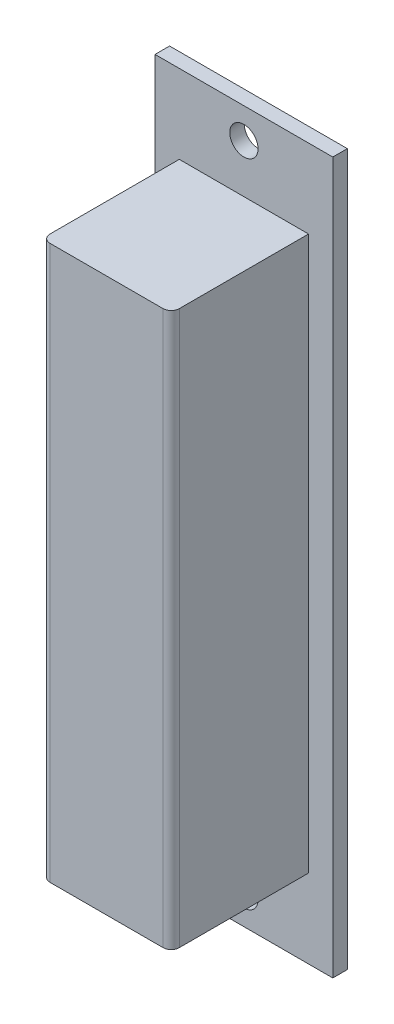
ISO-10303-21;
HEADER;
FILE_DESCRIPTION(('STEP AP214'),'2;1');
FILE_NAME('part.step','',(''),(''),'','','');
FILE_SCHEMA(('AUTOMOTIVE_DESIGN { 1 0 10303 214 1 1 1 1 }'));
ENDSEC;
DATA;
#1=APPLICATION_CONTEXT('core data for automotive mechanical design processes');
#2=APPLICATION_PROTOCOL_DEFINITION('international standard','automotive_design',2000,#1);
#3=PRODUCT_CONTEXT('',#1,'mechanical');
#4=PRODUCT('Part','Part','',(#3));
#5=PRODUCT_RELATED_PRODUCT_CATEGORY('part','',(#4));
#6=PRODUCT_DEFINITION_FORMATION('','',#4);
#7=PRODUCT_DEFINITION_CONTEXT('part definition',#1,'design');
#8=PRODUCT_DEFINITION('design','',#6,#7);
#9=PRODUCT_DEFINITION_SHAPE('','',#8);
#10=(LENGTH_UNIT() NAMED_UNIT(*) SI_UNIT(.MILLI.,.METRE.));
#11=(NAMED_UNIT(*) PLANE_ANGLE_UNIT() SI_UNIT($,.RADIAN.));
#12=(NAMED_UNIT(*) SI_UNIT($,.STERADIAN.) SOLID_ANGLE_UNIT());
#13=UNCERTAINTY_MEASURE_WITH_UNIT(LENGTH_MEASURE(1.E-05),#10,'distance_accuracy_value','');
#14=(GEOMETRIC_REPRESENTATION_CONTEXT(3) GLOBAL_UNCERTAINTY_ASSIGNED_CONTEXT((#13)) GLOBAL_UNIT_ASSIGNED_CONTEXT((#10,
#11,#12)) REPRESENTATION_CONTEXT('',''));
#15=CARTESIAN_POINT('',(0.,0.,0.));
#16=DIRECTION('',(0.,0.,1.));
#17=DIRECTION('',(1.,0.,0.));
#18=AXIS2_PLACEMENT_3D('',#15,#16,#17);
#19=CARTESIAN_POINT('',(-11.,-44.,1.8));
#20=DIRECTION('',(0.,0.,1.));
#21=DIRECTION('',(1.,0.,0.));
#22=AXIS2_PLACEMENT_3D('',#19,#20,#21);
#23=PLANE('',#22);
#24=CARTESIAN_POINT('',(0.,-40.25,1.8));
#25=DIRECTION('',(0.,0.,1.));
#26=DIRECTION('',(-1.,0.,0.));
#27=AXIS2_PLACEMENT_3D('',#24,#25,#26);
#28=CIRCLE('',#27,1.75);
#29=CARTESIAN_POINT('',(-1.75000000000005,-40.25,1.8));
#30=VERTEX_POINT('',#29);
#31=EDGE_CURVE('E144',#30,#30,#28,.T.);
#32=ORIENTED_EDGE('',*,*,#31,.F.);
#33=EDGE_LOOP('',(#32));
#34=FACE_BOUND('',#33,.T.);
#35=DIRECTION('',(0.,-1.,0.));
#36=VECTOR('',#35,1.);
#37=CARTESIAN_POINT('',(-11.,44.,1.8));
#38=LINE('',#37,#36);
#39=CARTESIAN_POINT('',(-11.,44.,1.8));
#40=VERTEX_POINT('',#39);
#41=CARTESIAN_POINT('',(-11.,-44.,1.8));
#42=VERTEX_POINT('',#41);
#43=EDGE_CURVE('E162',#40,#42,#38,.T.);
#44=ORIENTED_EDGE('',*,*,#43,.T.);
#45=DIRECTION('',(1.,0.,0.));
#46=VECTOR('',#45,1.);
#47=CARTESIAN_POINT('',(-11.,-44.,1.8));
#48=LINE('',#47,#46);
#49=CARTESIAN_POINT('',(11.,-44.,1.8));
#50=VERTEX_POINT('',#49);
#51=EDGE_CURVE('E165',#42,#50,#48,.T.);
#52=ORIENTED_EDGE('',*,*,#51,.T.);
#53=DIRECTION('',(0.,1.,0.));
#54=VECTOR('',#53,1.);
#55=CARTESIAN_POINT('',(11.,-44.,1.8));
#56=LINE('',#55,#54);
#57=CARTESIAN_POINT('',(11.,44.,1.8));
#58=VERTEX_POINT('',#57);
#59=EDGE_CURVE('E167',#50,#58,#56,.T.);
#60=ORIENTED_EDGE('',*,*,#59,.T.);
#61=DIRECTION('',(-1.,0.,0.));
#62=VECTOR('',#61,1.);
#63=CARTESIAN_POINT('',(-11.,44.,1.8));
#64=LINE('',#63,#62);
#65=EDGE_CURVE('E169',#58,#40,#64,.T.);
#66=ORIENTED_EDGE('',*,*,#65,.T.);
#67=EDGE_LOOP('',(#44,#52,#60,#66));
#68=FACE_BOUND('',#67,.T.);
#69=CARTESIAN_POINT('',(0.,40.25,1.8));
#70=DIRECTION('',(0.,0.,1.));
#71=DIRECTION('',(1.,0.,0.));
#72=AXIS2_PLACEMENT_3D('',#69,#70,#71);
#73=CIRCLE('',#72,1.75);
#74=CARTESIAN_POINT('',(1.75,40.25,1.8));
#75=VERTEX_POINT('',#74);
#76=EDGE_CURVE('E150',#75,#75,#73,.T.);
#77=ORIENTED_EDGE('',*,*,#76,.F.);
#78=EDGE_LOOP('',(#77));
#79=FACE_BOUND('',#78,.T.);
#80=DIRECTION('',(1.,0.,0.));
#81=VECTOR('',#80,1.);
#82=CARTESIAN_POINT('',(-8.,-34.25,1.8));
#83=LINE('',#82,#81);
#84=CARTESIAN_POINT('',(-8.,-34.25,1.8));
#85=VERTEX_POINT('',#84);
#86=CARTESIAN_POINT('',(8.00000000000001,-34.25,1.8));
#87=VERTEX_POINT('',#86);
#88=EDGE_CURVE('E111',#85,#87,#83,.T.);
#89=ORIENTED_EDGE('',*,*,#88,.F.);
#90=DIRECTION('',(0.,-1.,0.));
#91=VECTOR('',#90,1.);
#92=CARTESIAN_POINT('',(-8.,34.25,1.8));
#93=LINE('',#92,#91);
#94=CARTESIAN_POINT('',(-8.,34.25,1.8));
#95=VERTEX_POINT('',#94);
#96=EDGE_CURVE('E118',#95,#85,#93,.T.);
#97=ORIENTED_EDGE('',*,*,#96,.F.);
#98=DIRECTION('',(-1.,0.,0.));
#99=VECTOR('',#98,1.);
#100=CARTESIAN_POINT('',(-8.,34.25,1.8));
#101=LINE('',#100,#99);
#102=CARTESIAN_POINT('',(8.,34.25,1.8));
#103=VERTEX_POINT('',#102);
#104=EDGE_CURVE('E128',#103,#95,#101,.T.);
#105=ORIENTED_EDGE('',*,*,#104,.F.);
#106=DIRECTION('',(0.,1.,0.));
#107=VECTOR('',#106,1.);
#108=CARTESIAN_POINT('',(8.00000000000001,-34.25,1.8));
#109=LINE('',#108,#107);
#110=EDGE_CURVE('E126',#87,#103,#109,.T.);
#111=ORIENTED_EDGE('',*,*,#110,.F.);
#112=EDGE_LOOP('',(#89,#97,#105,#111));
#113=FACE_BOUND('',#112,.T.);
#114=ADVANCED_FACE('F29',(#34,#68,#79,#113),#23,.T.);
#115=CARTESIAN_POINT('',(-11.,-44.,0.));
#116=DIRECTION('',(0.,0.,1.));
#117=DIRECTION('',(1.,0.,0.));
#118=AXIS2_PLACEMENT_3D('',#115,#116,#117);
#119=PLANE('',#118);
#120=CARTESIAN_POINT('',(0.,40.25,0.));
#121=DIRECTION('',(0.,0.,1.));
#122=DIRECTION('',(1.,0.,0.));
#123=AXIS2_PLACEMENT_3D('',#120,#121,#122);
#124=CIRCLE('',#123,1.75);
#125=CARTESIAN_POINT('',(1.75,40.25,0.));
#126=VERTEX_POINT('',#125);
#127=EDGE_CURVE('E147',#126,#126,#124,.T.);
#128=ORIENTED_EDGE('',*,*,#127,.T.);
#129=EDGE_LOOP('',(#128));
#130=FACE_BOUND('',#129,.T.);
#131=DIRECTION('',(0.,-1.,0.));
#132=VECTOR('',#131,1.);
#133=CARTESIAN_POINT('',(-11.,44.,0.));
#134=LINE('',#133,#132);
#135=CARTESIAN_POINT('',(-11.,44.,0.));
#136=VERTEX_POINT('',#135);
#137=CARTESIAN_POINT('',(-11.,-44.,0.));
#138=VERTEX_POINT('',#137);
#139=EDGE_CURVE('E153',#136,#138,#134,.T.);
#140=ORIENTED_EDGE('',*,*,#139,.F.);
#141=DIRECTION('',(-1.,0.,0.));
#142=VECTOR('',#141,1.);
#143=CARTESIAN_POINT('',(-11.,44.,0.));
#144=LINE('',#143,#142);
#145=CARTESIAN_POINT('',(11.,44.,0.));
#146=VERTEX_POINT('',#145);
#147=EDGE_CURVE('E160',#146,#136,#144,.T.);
#148=ORIENTED_EDGE('',*,*,#147,.F.);
#149=DIRECTION('',(0.,1.,0.));
#150=VECTOR('',#149,1.);
#151=CARTESIAN_POINT('',(11.,-44.,0.));
#152=LINE('',#151,#150);
#153=CARTESIAN_POINT('',(11.,-44.,0.));
#154=VERTEX_POINT('',#153);
#155=EDGE_CURVE('E158',#154,#146,#152,.T.);
#156=ORIENTED_EDGE('',*,*,#155,.F.);
#157=DIRECTION('',(1.,0.,0.));
#158=VECTOR('',#157,1.);
#159=CARTESIAN_POINT('',(-11.,-44.,0.));
#160=LINE('',#159,#158);
#161=EDGE_CURVE('E156',#138,#154,#160,.T.);
#162=ORIENTED_EDGE('',*,*,#161,.F.);
#163=EDGE_LOOP('',(#140,#148,#156,#162));
#164=FACE_BOUND('',#163,.T.);
#165=CARTESIAN_POINT('',(0.,-40.25,0.));
#166=DIRECTION('',(0.,0.,1.));
#167=DIRECTION('',(-1.,0.,0.));
#168=AXIS2_PLACEMENT_3D('',#165,#166,#167);
#169=CIRCLE('',#168,1.75);
#170=CARTESIAN_POINT('',(-1.75000000000005,-40.25,0.));
#171=VERTEX_POINT('',#170);
#172=EDGE_CURVE('E114',#171,#171,#169,.T.);
#173=ORIENTED_EDGE('',*,*,#172,.T.);
#174=EDGE_LOOP('',(#173));
#175=FACE_BOUND('',#174,.T.);
#176=ADVANCED_FACE('F212',(#130,#164,#175),#119,.F.);
#177=CARTESIAN_POINT('',(-11.,44.,1.8));
#178=DIRECTION('',(1.,0.,0.));
#179=DIRECTION('',(0.,1.,0.));
#180=AXIS2_PLACEMENT_3D('',#177,#178,#179);
#181=PLANE('',#180);
#182=ORIENTED_EDGE('',*,*,#139,.T.);
#183=DIRECTION('',(0.,0.,-1.));
#184=VECTOR('',#183,1.);
#185=CARTESIAN_POINT('',(-11.,-44.,1.8));
#186=LINE('',#185,#184);
#187=EDGE_CURVE('E180',#42,#138,#186,.T.);
#188=ORIENTED_EDGE('',*,*,#187,.F.);
#189=ORIENTED_EDGE('',*,*,#43,.F.);
#190=DIRECTION('',(0.,0.,-1.));
#191=VECTOR('',#190,1.);
#192=CARTESIAN_POINT('',(-11.,44.,1.8));
#193=LINE('',#192,#191);
#194=EDGE_CURVE('E171',#40,#136,#193,.T.);
#195=ORIENTED_EDGE('',*,*,#194,.T.);
#196=EDGE_LOOP('',(#182,#188,#189,#195));
#197=FACE_BOUND('',#196,.T.);
#198=ADVANCED_FACE('F31',(#197),#181,.F.);
#199=CARTESIAN_POINT('',(-11.,-44.,1.8));
#200=DIRECTION('',(0.,1.,0.));
#201=DIRECTION('',(0.,0.,1.));
#202=AXIS2_PLACEMENT_3D('',#199,#200,#201);
#203=PLANE('',#202);
#204=ORIENTED_EDGE('',*,*,#161,.T.);
#205=DIRECTION('',(0.,0.,-1.));
#206=VECTOR('',#205,1.);
#207=CARTESIAN_POINT('',(11.,-44.,1.8));
#208=LINE('',#207,#206);
#209=EDGE_CURVE('E177',#50,#154,#208,.T.);
#210=ORIENTED_EDGE('',*,*,#209,.F.);
#211=ORIENTED_EDGE('',*,*,#51,.F.);
#212=ORIENTED_EDGE('',*,*,#187,.T.);
#213=EDGE_LOOP('',(#204,#210,#211,#212));
#214=FACE_BOUND('',#213,.T.);
#215=ADVANCED_FACE('F233',(#214),#203,.F.);
#216=CARTESIAN_POINT('',(11.,-44.,1.8));
#217=DIRECTION('',(-1.,0.,0.));
#218=DIRECTION('',(0.,-1.,0.));
#219=AXIS2_PLACEMENT_3D('',#216,#217,#218);
#220=PLANE('',#219);
#221=ORIENTED_EDGE('',*,*,#155,.T.);
#222=DIRECTION('',(0.,0.,-1.));
#223=VECTOR('',#222,1.);
#224=CARTESIAN_POINT('',(11.,44.,1.8));
#225=LINE('',#224,#223);
#226=EDGE_CURVE('E174',#58,#146,#225,.T.);
#227=ORIENTED_EDGE('',*,*,#226,.F.);
#228=ORIENTED_EDGE('',*,*,#59,.F.);
#229=ORIENTED_EDGE('',*,*,#209,.T.);
#230=EDGE_LOOP('',(#221,#227,#228,#229));
#231=FACE_BOUND('',#230,.T.);
#232=ADVANCED_FACE('F230',(#231),#220,.F.);
#233=CARTESIAN_POINT('',(-11.,44.,1.8));
#234=DIRECTION('',(0.,-1.,0.));
#235=DIRECTION('',(0.,0.,-1.));
#236=AXIS2_PLACEMENT_3D('',#233,#234,#235);
#237=PLANE('',#236);
#238=ORIENTED_EDGE('',*,*,#147,.T.);
#239=ORIENTED_EDGE('',*,*,#194,.F.);
#240=ORIENTED_EDGE('',*,*,#65,.F.);
#241=ORIENTED_EDGE('',*,*,#226,.T.);
#242=EDGE_LOOP('',(#238,#239,#240,#241));
#243=FACE_BOUND('',#242,.T.);
#244=ADVANCED_FACE('F226',(#243),#237,.F.);
#245=CARTESIAN_POINT('',(0.,40.25,1.8));
#246=DIRECTION('',(0.,0.,-1.));
#247=DIRECTION('',(-1.,0.,0.));
#248=AXIS2_PLACEMENT_3D('',#245,#246,#247);
#249=CYLINDRICAL_SURFACE('',#248,1.75);
#250=ORIENTED_EDGE('',*,*,#76,.T.);
#251=EDGE_LOOP('',(#250));
#252=FACE_BOUND('',#251,.T.);
#253=ORIENTED_EDGE('',*,*,#127,.F.);
#254=EDGE_LOOP('',(#253));
#255=FACE_BOUND('',#254,.T.);
#256=ADVANCED_FACE('F229',(#252,#255),#249,.F.);
#257=CARTESIAN_POINT('',(0.,-40.25,1.8));
#258=DIRECTION('',(0.,0.,-1.));
#259=DIRECTION('',(-1.,0.,0.));
#260=AXIS2_PLACEMENT_3D('',#257,#258,#259);
#261=CYLINDRICAL_SURFACE('',#260,1.75);
#262=ORIENTED_EDGE('',*,*,#31,.T.);
#263=EDGE_LOOP('',(#262));
#264=FACE_BOUND('',#263,.T.);
#265=ORIENTED_EDGE('',*,*,#172,.F.);
#266=EDGE_LOOP('',(#265));
#267=FACE_BOUND('',#266,.T.);
#268=ADVANCED_FACE('F258',(#264,#267),#261,.F.);
#269=CARTESIAN_POINT('',(-8.,34.25,18.8));
#270=DIRECTION('',(1.,0.,0.));
#271=DIRECTION('',(0.,1.,0.));
#272=AXIS2_PLACEMENT_3D('',#269,#270,#271);
#273=PLANE('',#272);
#274=DIRECTION('',(0.,0.,-1.));
#275=VECTOR('',#274,1.);
#276=CARTESIAN_POINT('',(-8.,-34.25,18.8));
#277=LINE('',#276,#275);
#278=CARTESIAN_POINT('',(-8.,-34.25,17.8));
#279=VERTEX_POINT('',#278);
#280=EDGE_CURVE('E105',#279,#85,#277,.T.);
#281=ORIENTED_EDGE('',*,*,#280,.F.);
#282=DIRECTION('',(0.,-1.,0.));
#283=VECTOR('',#282,1.);
#284=CARTESIAN_POINT('',(-8.,34.25,17.8));
#285=LINE('',#284,#283);
#286=CARTESIAN_POINT('',(-8.,34.25,17.8));
#287=VERTEX_POINT('',#286);
#288=EDGE_CURVE('E52',#279,#287,#285,.F.);
#289=ORIENTED_EDGE('',*,*,#288,.T.);
#290=DIRECTION('',(0.,0.,-1.));
#291=VECTOR('',#290,1.);
#292=CARTESIAN_POINT('',(-8.,34.25,18.8));
#293=LINE('',#292,#291);
#294=EDGE_CURVE('E120',#287,#95,#293,.T.);
#295=ORIENTED_EDGE('',*,*,#294,.T.);
#296=ORIENTED_EDGE('',*,*,#96,.T.);
#297=EDGE_LOOP('',(#281,#289,#295,#296));
#298=FACE_BOUND('',#297,.T.);
#299=ADVANCED_FACE('F119',(#298),#273,.F.);
#300=CARTESIAN_POINT('',(-8.,-34.25,18.8));
#301=DIRECTION('',(0.,1.,0.));
#302=DIRECTION('',(0.,0.,1.));
#303=AXIS2_PLACEMENT_3D('',#300,#301,#302);
#304=PLANE('',#303);
#305=DIRECTION('',(1.,0.,0.));
#306=VECTOR('',#305,1.);
#307=CARTESIAN_POINT('',(-8.,-34.25,18.8));
#308=LINE('',#307,#306);
#309=CARTESIAN_POINT('',(-7.,-34.25,18.8));
#310=VERTEX_POINT('',#309);
#311=CARTESIAN_POINT('',(7.00000000000001,-34.25,18.8));
#312=VERTEX_POINT('',#311);
#313=EDGE_CURVE('E132',#310,#312,#308,.T.);
#314=ORIENTED_EDGE('',*,*,#313,.F.);
#315=CARTESIAN_POINT('',(-7.,-34.25,17.8));
#316=DIRECTION('',(0.,1.,0.));
#317=DIRECTION('',(0.,0.,1.));
#318=AXIS2_PLACEMENT_3D('',#315,#316,#317);
#319=CIRCLE('',#318,1.);
#320=EDGE_CURVE('E113',#310,#279,#319,.F.);
#321=ORIENTED_EDGE('',*,*,#320,.T.);
#322=ORIENTED_EDGE('',*,*,#280,.T.);
#323=ORIENTED_EDGE('',*,*,#88,.T.);
#324=DIRECTION('',(0.,0.,-1.));
#325=VECTOR('',#324,1.);
#326=CARTESIAN_POINT('',(8.00000000000001,-34.25,18.8));
#327=LINE('',#326,#325);
#328=CARTESIAN_POINT('',(8.00000000000001,-34.25,17.8));
#329=VERTEX_POINT('',#328);
#330=EDGE_CURVE('E115',#329,#87,#327,.T.);
#331=ORIENTED_EDGE('',*,*,#330,.F.);
#332=CARTESIAN_POINT('',(7.00000000000001,-34.25,17.8));
#333=DIRECTION('',(0.,1.,0.));
#334=DIRECTION('',(0.,0.,1.));
#335=AXIS2_PLACEMENT_3D('',#332,#333,#334);
#336=CIRCLE('',#335,1.);
#337=EDGE_CURVE('E189',#329,#312,#336,.F.);
#338=ORIENTED_EDGE('',*,*,#337,.T.);
#339=EDGE_LOOP('',(#314,#321,#322,#323,#331,#338));
#340=FACE_BOUND('',#339,.T.);
#341=ADVANCED_FACE('F108',(#340),#304,.F.);
#342=CARTESIAN_POINT('',(8.00000000000001,-34.25,18.8));
#343=DIRECTION('',(-1.,0.,0.));
#344=DIRECTION('',(0.,-1.,0.));
#345=AXIS2_PLACEMENT_3D('',#342,#343,#344);
#346=PLANE('',#345);
#347=DIRECTION('',(0.,0.,-1.));
#348=VECTOR('',#347,1.);
#349=CARTESIAN_POINT('',(8.,34.25,18.8));
#350=LINE('',#349,#348);
#351=CARTESIAN_POINT('',(8.,34.25,17.8));
#352=VERTEX_POINT('',#351);
#353=EDGE_CURVE('E139',#352,#103,#350,.T.);
#354=ORIENTED_EDGE('',*,*,#353,.F.);
#355=DIRECTION('',(0.,1.,0.));
#356=VECTOR('',#355,1.);
#357=CARTESIAN_POINT('',(8.00000000000001,-34.25,17.8));
#358=LINE('',#357,#356);
#359=EDGE_CURVE('E11',#352,#329,#358,.F.);
#360=ORIENTED_EDGE('',*,*,#359,.T.);
#361=ORIENTED_EDGE('',*,*,#330,.T.);
#362=ORIENTED_EDGE('',*,*,#110,.T.);
#363=EDGE_LOOP('',(#354,#360,#361,#362));
#364=FACE_BOUND('',#363,.T.);
#365=ADVANCED_FACE('F268',(#364),#346,.F.);
#366=CARTESIAN_POINT('',(-8.,34.25,18.8));
#367=DIRECTION('',(0.,-1.,0.));
#368=DIRECTION('',(0.,0.,-1.));
#369=AXIS2_PLACEMENT_3D('',#366,#367,#368);
#370=PLANE('',#369);
#371=ORIENTED_EDGE('',*,*,#294,.F.);
#372=CARTESIAN_POINT('',(-7.,34.25,17.8));
#373=DIRECTION('',(0.,-1.,0.));
#374=DIRECTION('',(0.,0.,-1.));
#375=AXIS2_PLACEMENT_3D('',#372,#373,#374);
#376=CIRCLE('',#375,1.);
#377=CARTESIAN_POINT('',(-7.,34.25,18.8));
#378=VERTEX_POINT('',#377);
#379=EDGE_CURVE('E37',#287,#378,#376,.F.);
#380=ORIENTED_EDGE('',*,*,#379,.T.);
#381=DIRECTION('',(-1.,0.,0.));
#382=VECTOR('',#381,1.);
#383=CARTESIAN_POINT('',(-8.,34.25,18.8));
#384=LINE('',#383,#382);
#385=CARTESIAN_POINT('',(7.,34.25,18.8));
#386=VERTEX_POINT('',#385);
#387=EDGE_CURVE('E135',#386,#378,#384,.T.);
#388=ORIENTED_EDGE('',*,*,#387,.F.);
#389=CARTESIAN_POINT('',(7.,34.25,17.8));
#390=DIRECTION('',(0.,-1.,0.));
#391=DIRECTION('',(0.,0.,-1.));
#392=AXIS2_PLACEMENT_3D('',#389,#390,#391);
#393=CIRCLE('',#392,1.);
#394=EDGE_CURVE('E44',#386,#352,#393,.F.);
#395=ORIENTED_EDGE('',*,*,#394,.T.);
#396=ORIENTED_EDGE('',*,*,#353,.T.);
#397=ORIENTED_EDGE('',*,*,#104,.T.);
#398=EDGE_LOOP('',(#371,#380,#388,#395,#396,#397));
#399=FACE_BOUND('',#398,.T.);
#400=ADVANCED_FACE('F194',(#399),#370,.F.);
#401=CARTESIAN_POINT('',(-8.,-34.25,18.8));
#402=DIRECTION('',(0.,0.,1.));
#403=DIRECTION('',(1.,0.,0.));
#404=AXIS2_PLACEMENT_3D('',#401,#402,#403);
#405=PLANE('',#404);
#406=ORIENTED_EDGE('',*,*,#387,.T.);
#407=DIRECTION('',(0.,-1.,0.));
#408=VECTOR('',#407,1.);
#409=CARTESIAN_POINT('',(-7.,-34.25,18.8));
#410=LINE('',#409,#408);
#411=EDGE_CURVE('E186',#378,#310,#410,.T.);
#412=ORIENTED_EDGE('',*,*,#411,.T.);
#413=ORIENTED_EDGE('',*,*,#313,.T.);
#414=DIRECTION('',(0.,1.,0.));
#415=VECTOR('',#414,1.);
#416=CARTESIAN_POINT('',(7.,34.25,18.8));
#417=LINE('',#416,#415);
#418=EDGE_CURVE('E183',#312,#386,#417,.T.);
#419=ORIENTED_EDGE('',*,*,#418,.T.);
#420=EDGE_LOOP('',(#406,#412,#413,#419));
#421=FACE_BOUND('',#420,.T.);
#422=ADVANCED_FACE('F198',(#421),#405,.T.);
#423=CARTESIAN_POINT('',(-7.,-34.25,17.8));
#424=DIRECTION('',(0.,1.,0.));
#425=DIRECTION('',(-1.,0.,0.));
#426=AXIS2_PLACEMENT_3D('',#423,#424,#425);
#427=CYLINDRICAL_SURFACE('',#426,1.);
#428=ORIENTED_EDGE('',*,*,#379,.F.);
#429=ORIENTED_EDGE('',*,*,#288,.F.);
#430=ORIENTED_EDGE('',*,*,#320,.F.);
#431=ORIENTED_EDGE('',*,*,#411,.F.);
#432=EDGE_LOOP('',(#428,#429,#430,#431));
#433=FACE_BOUND('',#432,.T.);
#434=ADVANCED_FACE('F200',(#433),#427,.T.);
#435=CARTESIAN_POINT('',(7.00000000000001,-34.25,17.8));
#436=DIRECTION('',(0.,-1.,0.));
#437=DIRECTION('',(1.,0.,0.));
#438=AXIS2_PLACEMENT_3D('',#435,#436,#437);
#439=CYLINDRICAL_SURFACE('',#438,1.);
#440=ORIENTED_EDGE('',*,*,#337,.F.);
#441=ORIENTED_EDGE('',*,*,#359,.F.);
#442=ORIENTED_EDGE('',*,*,#394,.F.);
#443=ORIENTED_EDGE('',*,*,#418,.F.);
#444=EDGE_LOOP('',(#440,#441,#442,#443));
#445=FACE_BOUND('',#444,.T.);
#446=ADVANCED_FACE('F202',(#445),#439,.T.);
#447=CLOSED_SHELL('',(#114,#176,#198,#215,#232,#244,#256,#268,#299,#341,#365,#400,#422,#434,#446));
#448=MANIFOLD_SOLID_BREP('B2',#447);
#449=ADVANCED_BREP_SHAPE_REPRESENTATION('',(#18,#448),#14);
#450=SHAPE_DEFINITION_REPRESENTATION(#9,#449);
ENDSEC;
END-ISO-10303-21;
